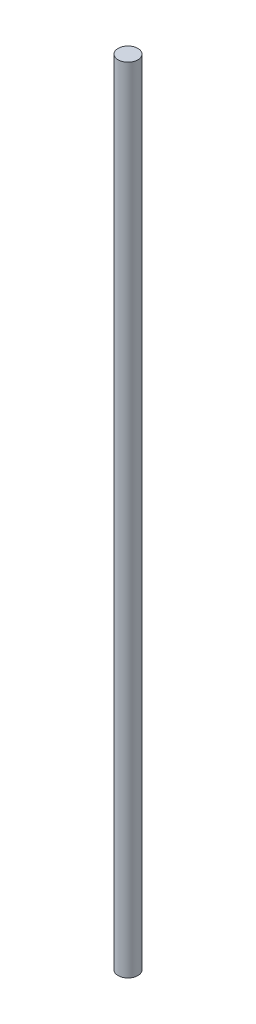
ISO-10303-21;
HEADER;
FILE_DESCRIPTION(('STEP AP214'),'2;1');
FILE_NAME('part.step','',(''),(''),'','','');
FILE_SCHEMA(('AUTOMOTIVE_DESIGN { 1 0 10303 214 1 1 1 1 }'));
ENDSEC;
DATA;
#1=APPLICATION_CONTEXT('core data for automotive mechanical design processes');
#2=APPLICATION_PROTOCOL_DEFINITION('international standard','automotive_design',2000,#1);
#3=PRODUCT_CONTEXT('',#1,'mechanical');
#4=PRODUCT('Part','Part','',(#3));
#5=PRODUCT_RELATED_PRODUCT_CATEGORY('part','',(#4));
#6=PRODUCT_DEFINITION_FORMATION('','',#4);
#7=PRODUCT_DEFINITION_CONTEXT('part definition',#1,'design');
#8=PRODUCT_DEFINITION('design','',#6,#7);
#9=PRODUCT_DEFINITION_SHAPE('','',#8);
#10=(LENGTH_UNIT() NAMED_UNIT(*) SI_UNIT(.MILLI.,.METRE.));
#11=(NAMED_UNIT(*) PLANE_ANGLE_UNIT() SI_UNIT($,.RADIAN.));
#12=(NAMED_UNIT(*) SI_UNIT($,.STERADIAN.) SOLID_ANGLE_UNIT());
#13=UNCERTAINTY_MEASURE_WITH_UNIT(LENGTH_MEASURE(1.E-05),#10,'distance_accuracy_value','');
#14=(GEOMETRIC_REPRESENTATION_CONTEXT(3) GLOBAL_UNCERTAINTY_ASSIGNED_CONTEXT((#13)) GLOBAL_UNIT_ASSIGNED_CONTEXT((#10,
#11,#12)) REPRESENTATION_CONTEXT('',''));
#15=CARTESIAN_POINT('',(0.,0.,0.));
#16=DIRECTION('',(0.,0.,1.));
#17=DIRECTION('',(1.,0.,0.));
#18=AXIS2_PLACEMENT_3D('',#15,#16,#17);
#19=CARTESIAN_POINT('',(0.,200.,0.));
#20=DIRECTION('',(0.,-1.,0.));
#21=DIRECTION('',(0.,0.,-1.));
#22=AXIS2_PLACEMENT_3D('',#19,#20,#21);
#23=CYLINDRICAL_SURFACE('',#22,2.5);
#24=CARTESIAN_POINT('',(0.,200.,0.));
#25=DIRECTION('',(0.,1.,0.));
#26=DIRECTION('',(0.,0.,1.));
#27=AXIS2_PLACEMENT_3D('',#24,#25,#26);
#28=CIRCLE('',#27,2.5);
#29=CARTESIAN_POINT('',(0.,200.,2.5));
#30=VERTEX_POINT('',#29);
#31=EDGE_CURVE('E10',#30,#30,#28,.T.);
#32=ORIENTED_EDGE('',*,*,#31,.F.);
#33=EDGE_LOOP('',(#32));
#34=FACE_BOUND('',#33,.T.);
#35=CARTESIAN_POINT('',(0.,0.,0.));
#36=DIRECTION('',(0.,1.,0.));
#37=DIRECTION('',(0.,0.,1.));
#38=AXIS2_PLACEMENT_3D('',#35,#36,#37);
#39=CIRCLE('',#38,2.5);
#40=CARTESIAN_POINT('',(0.,0.,2.5));
#41=VERTEX_POINT('',#40);
#42=EDGE_CURVE('E34',#41,#41,#39,.T.);
#43=ORIENTED_EDGE('',*,*,#42,.T.);
#44=EDGE_LOOP('',(#43));
#45=FACE_BOUND('',#44,.T.);
#46=ADVANCED_FACE('F31',(#34,#45),#23,.T.);
#47=CARTESIAN_POINT('',(0.,200.,0.));
#48=DIRECTION('',(0.,1.,0.));
#49=DIRECTION('',(0.,0.,1.));
#50=AXIS2_PLACEMENT_3D('',#47,#48,#49);
#51=PLANE('',#50);
#52=ORIENTED_EDGE('',*,*,#31,.T.);
#53=EDGE_LOOP('',(#52));
#54=FACE_BOUND('',#53,.T.);
#55=ADVANCED_FACE('F46',(#54),#51,.T.);
#56=CARTESIAN_POINT('',(0.,0.,0.));
#57=DIRECTION('',(0.,1.,0.));
#58=DIRECTION('',(0.,0.,1.));
#59=AXIS2_PLACEMENT_3D('',#56,#57,#58);
#60=PLANE('',#59);
#61=ORIENTED_EDGE('',*,*,#42,.F.);
#62=EDGE_LOOP('',(#61));
#63=FACE_BOUND('',#62,.T.);
#64=ADVANCED_FACE('F44',(#63),#60,.F.);
#65=CLOSED_SHELL('',(#46,#55,#64));
#66=MANIFOLD_SOLID_BREP('B2',#65);
#67=ADVANCED_BREP_SHAPE_REPRESENTATION('',(#18,#66),#14);
#68=SHAPE_DEFINITION_REPRESENTATION(#9,#67);
ENDSEC;
END-ISO-10303-21;
